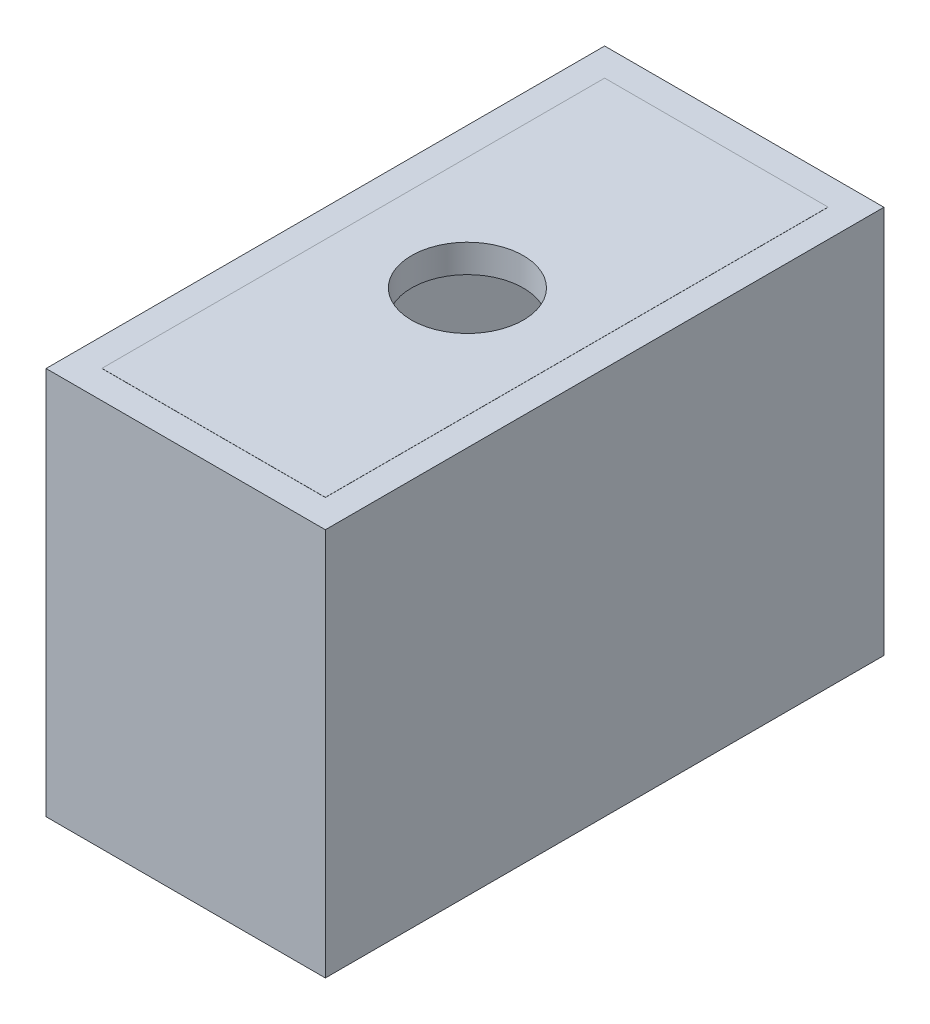
ISO-10303-21;
HEADER;
FILE_DESCRIPTION(('STEP AP214'),'2;1');
FILE_NAME('part.step','',(''),(''),'','','');
FILE_SCHEMA(('AUTOMOTIVE_DESIGN { 1 0 10303 214 1 1 1 1 }'));
ENDSEC;
DATA;
#1=APPLICATION_CONTEXT('core data for automotive mechanical design processes');
#2=APPLICATION_PROTOCOL_DEFINITION('international standard','automotive_design',2000,#1);
#3=PRODUCT_CONTEXT('',#1,'mechanical');
#4=PRODUCT('Part','Part','',(#3));
#5=PRODUCT_RELATED_PRODUCT_CATEGORY('part','',(#4));
#6=PRODUCT_DEFINITION_FORMATION('','',#4);
#7=PRODUCT_DEFINITION_CONTEXT('part definition',#1,'design');
#8=PRODUCT_DEFINITION('design','',#6,#7);
#9=PRODUCT_DEFINITION_SHAPE('','',#8);
#10=(LENGTH_UNIT() NAMED_UNIT(*) SI_UNIT(.MILLI.,.METRE.));
#11=(NAMED_UNIT(*) PLANE_ANGLE_UNIT() SI_UNIT($,.RADIAN.));
#12=(NAMED_UNIT(*) SI_UNIT($,.STERADIAN.) SOLID_ANGLE_UNIT());
#13=UNCERTAINTY_MEASURE_WITH_UNIT(LENGTH_MEASURE(1.E-05),#10,'distance_accuracy_value','');
#14=(GEOMETRIC_REPRESENTATION_CONTEXT(3) GLOBAL_UNCERTAINTY_ASSIGNED_CONTEXT((#13)) GLOBAL_UNIT_ASSIGNED_CONTEXT((#10,
#11,#12)) REPRESENTATION_CONTEXT('',''));
#15=CARTESIAN_POINT('',(0.,0.,0.));
#16=DIRECTION('',(0.,0.,1.));
#17=DIRECTION('',(1.,0.,0.));
#18=AXIS2_PLACEMENT_3D('',#15,#16,#17);
#19=CARTESIAN_POINT('',(-20.5611392405063,70.61,-22.9564556962026));
#20=DIRECTION('',(1.,0.,0.));
#21=DIRECTION('',(0.,0.,-1.));
#22=AXIS2_PLACEMENT_3D('',#19,#20,#21);
#23=PLANE('',#22);
#24=DIRECTION('',(0.,-1.,0.));
#25=VECTOR('',#24,1.);
#26=CARTESIAN_POINT('',(-20.5611392405063,70.61,-22.9564556962026));
#27=LINE('',#26,#25);
#28=CARTESIAN_POINT('',(-20.5611392405063,65.53,-22.9564556962026));
#29=VERTEX_POINT('',#28);
#30=CARTESIAN_POINT('',(-20.5611392405063,0.,-22.9564556962026));
#31=VERTEX_POINT('',#30);
#32=EDGE_CURVE('E202',#29,#31,#27,.T.);
#33=ORIENTED_EDGE('',*,*,#32,.F.);
#34=DIRECTION('',(0.,0.,1.));
#35=VECTOR('',#34,1.);
#36=CARTESIAN_POINT('',(-20.5611392405063,65.53,-22.9564556962026));
#37=LINE('',#36,#35);
#38=CARTESIAN_POINT('',(-20.5611392405063,65.53,68.4835443037974));
#39=VERTEX_POINT('',#38);
#40=EDGE_CURVE('E55',#29,#39,#37,.T.);
#41=ORIENTED_EDGE('',*,*,#40,.T.);
#42=DIRECTION('',(0.,-1.,0.));
#43=VECTOR('',#42,1.);
#44=CARTESIAN_POINT('',(-20.5611392405063,70.61,68.4835443037974));
#45=LINE('',#44,#43);
#46=CARTESIAN_POINT('',(-20.5611392405063,0.,68.4835443037974));
#47=VERTEX_POINT('',#46);
#48=EDGE_CURVE('E225',#39,#47,#45,.T.);
#49=ORIENTED_EDGE('',*,*,#48,.T.);
#50=DIRECTION('',(0.,0.,1.));
#51=VECTOR('',#50,1.);
#52=CARTESIAN_POINT('',(-20.5611392405063,0.,-22.9564556962026));
#53=LINE('',#52,#51);
#54=EDGE_CURVE('E185',#31,#47,#53,.T.);
#55=ORIENTED_EDGE('',*,*,#54,.F.);
#56=EDGE_LOOP('',(#33,#41,#49,#55));
#57=FACE_BOUND('',#56,.T.);
#58=ADVANCED_FACE('F39',(#57),#23,.T.);
#59=CARTESIAN_POINT('',(-20.5611392405063,70.61,68.4835443037974));
#60=DIRECTION('',(0.,0.,-1.));
#61=DIRECTION('',(-1.,0.,0.));
#62=AXIS2_PLACEMENT_3D('',#59,#60,#61);
#63=PLANE('',#62);
#64=ORIENTED_EDGE('',*,*,#48,.F.);
#65=DIRECTION('',(1.,0.,0.));
#66=VECTOR('',#65,1.);
#67=CARTESIAN_POINT('',(-20.5611392405063,65.53,68.4835443037974));
#68=LINE('',#67,#66);
#69=CARTESIAN_POINT('',(20.0788607594937,65.53,68.4835443037974));
#70=VERTEX_POINT('',#69);
#71=EDGE_CURVE('E172',#39,#70,#68,.T.);
#72=ORIENTED_EDGE('',*,*,#71,.T.);
#73=DIRECTION('',(0.,-1.,0.));
#74=VECTOR('',#73,1.);
#75=CARTESIAN_POINT('',(20.0788607594937,70.61,68.4835443037974));
#76=LINE('',#75,#74);
#77=CARTESIAN_POINT('',(20.0788607594937,0.,68.4835443037974));
#78=VERTEX_POINT('',#77);
#79=EDGE_CURVE('E222',#70,#78,#76,.T.);
#80=ORIENTED_EDGE('',*,*,#79,.T.);
#81=DIRECTION('',(1.,0.,0.));
#82=VECTOR('',#81,1.);
#83=CARTESIAN_POINT('',(-20.5611392405063,0.,68.4835443037974));
#84=LINE('',#83,#82);
#85=EDGE_CURVE('E206',#47,#78,#84,.T.);
#86=ORIENTED_EDGE('',*,*,#85,.F.);
#87=EDGE_LOOP('',(#64,#72,#80,#86));
#88=FACE_BOUND('',#87,.T.);
#89=ADVANCED_FACE('F292',(#88),#63,.T.);
#90=CARTESIAN_POINT('',(20.0788607594937,70.61,-22.9564556962026));
#91=DIRECTION('',(-1.,0.,0.));
#92=DIRECTION('',(0.,0.,1.));
#93=AXIS2_PLACEMENT_3D('',#90,#91,#92);
#94=PLANE('',#93);
#95=ORIENTED_EDGE('',*,*,#79,.F.);
#96=DIRECTION('',(0.,0.,-1.));
#97=VECTOR('',#96,1.);
#98=CARTESIAN_POINT('',(20.0788607594937,65.53,-22.9564556962026));
#99=LINE('',#98,#97);
#100=CARTESIAN_POINT('',(20.0788607594937,65.53,-22.9564556962026));
#101=VERTEX_POINT('',#100);
#102=EDGE_CURVE('E176',#70,#101,#99,.T.);
#103=ORIENTED_EDGE('',*,*,#102,.T.);
#104=DIRECTION('',(0.,-1.,0.));
#105=VECTOR('',#104,1.);
#106=CARTESIAN_POINT('',(20.0788607594937,70.61,-22.9564556962026));
#107=LINE('',#106,#105);
#108=CARTESIAN_POINT('',(20.0788607594937,0.,-22.9564556962026));
#109=VERTEX_POINT('',#108);
#110=EDGE_CURVE('E219',#101,#109,#107,.T.);
#111=ORIENTED_EDGE('',*,*,#110,.T.);
#112=DIRECTION('',(0.,0.,-1.));
#113=VECTOR('',#112,1.);
#114=CARTESIAN_POINT('',(20.0788607594937,0.,-22.9564556962026));
#115=LINE('',#114,#113);
#116=EDGE_CURVE('E210',#78,#109,#115,.T.);
#117=ORIENTED_EDGE('',*,*,#116,.F.);
#118=EDGE_LOOP('',(#95,#103,#111,#117));
#119=FACE_BOUND('',#118,.T.);
#120=ADVANCED_FACE('F298',(#119),#94,.T.);
#121=CARTESIAN_POINT('',(-20.5611392405063,70.61,-22.9564556962026));
#122=DIRECTION('',(0.,0.,1.));
#123=DIRECTION('',(1.,0.,0.));
#124=AXIS2_PLACEMENT_3D('',#121,#122,#123);
#125=PLANE('',#124);
#126=ORIENTED_EDGE('',*,*,#110,.F.);
#127=DIRECTION('',(-1.,0.,0.));
#128=VECTOR('',#127,1.);
#129=CARTESIAN_POINT('',(-20.5611392405063,65.53,-22.9564556962026));
#130=LINE('',#129,#128);
#131=EDGE_CURVE('E141',#101,#29,#130,.T.);
#132=ORIENTED_EDGE('',*,*,#131,.T.);
#133=ORIENTED_EDGE('',*,*,#32,.T.);
#134=DIRECTION('',(-1.,0.,0.));
#135=VECTOR('',#134,1.);
#136=CARTESIAN_POINT('',(-20.5611392405063,0.,-22.9564556962026));
#137=LINE('',#136,#135);
#138=EDGE_CURVE('E194',#109,#31,#137,.T.);
#139=ORIENTED_EDGE('',*,*,#138,.F.);
#140=EDGE_LOOP('',(#126,#132,#133,#139));
#141=FACE_BOUND('',#140,.T.);
#142=ADVANCED_FACE('F306',(#141),#125,.T.);
#143=CARTESIAN_POINT('',(0.,70.61,0.));
#144=DIRECTION('',(0.,1.,0.));
#145=DIRECTION('',(0.,0.,1.));
#146=AXIS2_PLACEMENT_3D('',#143,#144,#145);
#147=PLANE('',#146);
#148=DIRECTION('',(0.,0.,1.));
#149=VECTOR('',#148,1.);
#150=CARTESIAN_POINT('',(-25.6411392405063,70.61,-28.0364556962026));
#151=LINE('',#150,#149);
#152=CARTESIAN_POINT('',(-25.6411392405063,70.61,-28.0364556962026));
#153=VERTEX_POINT('',#152);
#154=CARTESIAN_POINT('',(-25.6411392405063,70.61,73.5635443037974));
#155=VERTEX_POINT('',#154);
#156=EDGE_CURVE('E229',#153,#155,#151,.T.);
#157=ORIENTED_EDGE('',*,*,#156,.T.);
#158=DIRECTION('',(1.,0.,0.));
#159=VECTOR('',#158,1.);
#160=CARTESIAN_POINT('',(-25.6411392405063,70.61,73.5635443037974));
#161=LINE('',#160,#159);
#162=CARTESIAN_POINT('',(25.1588607594937,70.61,73.5635443037974));
#163=VERTEX_POINT('',#162);
#164=EDGE_CURVE('E233',#155,#163,#161,.T.);
#165=ORIENTED_EDGE('',*,*,#164,.T.);
#166=DIRECTION('',(0.,0.,-1.));
#167=VECTOR('',#166,1.);
#168=CARTESIAN_POINT('',(25.1588607594937,70.61,-28.0364556962026));
#169=LINE('',#168,#167);
#170=CARTESIAN_POINT('',(25.1588607594937,70.61,-28.0364556962026));
#171=VERTEX_POINT('',#170);
#172=EDGE_CURVE('E237',#163,#171,#169,.T.);
#173=ORIENTED_EDGE('',*,*,#172,.T.);
#174=DIRECTION('',(-1.,0.,0.));
#175=VECTOR('',#174,1.);
#176=CARTESIAN_POINT('',(-25.6411392405063,70.61,-28.0364556962026));
#177=LINE('',#176,#175);
#178=EDGE_CURVE('E240',#171,#153,#177,.T.);
#179=ORIENTED_EDGE('',*,*,#178,.T.);
#180=EDGE_LOOP('',(#157,#165,#173,#179));
#181=FACE_BOUND('',#180,.T.);
#182=DIRECTION('',(1.,0.,0.));
#183=VECTOR('',#182,1.);
#184=CARTESIAN_POINT('',(-20.5611392405063,70.61,68.4835443037974));
#185=LINE('',#184,#183);
#186=CARTESIAN_POINT('',(-20.5611392405063,70.61,68.4835443037974));
#187=VERTEX_POINT('',#186);
#188=CARTESIAN_POINT('',(20.0788607594937,70.61,68.4835443037974));
#189=VERTEX_POINT('',#188);
#190=EDGE_CURVE('E193',#187,#189,#185,.T.);
#191=ORIENTED_EDGE('',*,*,#190,.F.);
#192=DIRECTION('',(0.,0.,1.));
#193=VECTOR('',#192,1.);
#194=CARTESIAN_POINT('',(-20.5611392405063,70.61,-22.9564556962026));
#195=LINE('',#194,#193);
#196=CARTESIAN_POINT('',(-20.5611392405063,70.61,-22.9564556962026));
#197=VERTEX_POINT('',#196);
#198=EDGE_CURVE('E136',#197,#187,#195,.T.);
#199=ORIENTED_EDGE('',*,*,#198,.F.);
#200=DIRECTION('',(-1.,0.,0.));
#201=VECTOR('',#200,1.);
#202=CARTESIAN_POINT('',(-20.5611392405063,70.61,-22.9564556962026));
#203=LINE('',#202,#201);
#204=CARTESIAN_POINT('',(20.0788607594937,70.61,-22.9564556962026));
#205=VERTEX_POINT('',#204);
#206=EDGE_CURVE('E63',#205,#197,#203,.T.);
#207=ORIENTED_EDGE('',*,*,#206,.F.);
#208=DIRECTION('',(0.,0.,-1.));
#209=VECTOR('',#208,1.);
#210=CARTESIAN_POINT('',(20.0788607594937,70.61,-22.9564556962026));
#211=LINE('',#210,#209);
#212=EDGE_CURVE('E197',#189,#205,#211,.T.);
#213=ORIENTED_EDGE('',*,*,#212,.F.);
#214=EDGE_LOOP('',(#191,#199,#207,#213));
#215=FACE_BOUND('',#214,.T.);
#216=ADVANCED_FACE('F283',(#181,#215),#147,.T.);
#217=CARTESIAN_POINT('',(0.,0.,0.));
#218=DIRECTION('',(0.,1.,0.));
#219=DIRECTION('',(0.,0.,1.));
#220=AXIS2_PLACEMENT_3D('',#217,#218,#219);
#221=PLANE('',#220);
#222=DIRECTION('',(0.,0.,1.));
#223=VECTOR('',#222,1.);
#224=CARTESIAN_POINT('',(-25.6411392405063,0.,-28.0364556962026));
#225=LINE('',#224,#223);
#226=CARTESIAN_POINT('',(-25.6411392405063,0.,-28.0364556962026));
#227=VERTEX_POINT('',#226);
#228=CARTESIAN_POINT('',(-25.6411392405063,0.,73.5635443037974));
#229=VERTEX_POINT('',#228);
#230=EDGE_CURVE('E228',#227,#229,#225,.T.);
#231=ORIENTED_EDGE('',*,*,#230,.F.);
#232=DIRECTION('',(-1.,0.,0.));
#233=VECTOR('',#232,1.);
#234=CARTESIAN_POINT('',(-25.6411392405063,0.,-28.0364556962026));
#235=LINE('',#234,#233);
#236=CARTESIAN_POINT('',(25.1588607594937,0.,-28.0364556962026));
#237=VERTEX_POINT('',#236);
#238=EDGE_CURVE('E234',#237,#227,#235,.T.);
#239=ORIENTED_EDGE('',*,*,#238,.F.);
#240=DIRECTION('',(0.,0.,-1.));
#241=VECTOR('',#240,1.);
#242=CARTESIAN_POINT('',(25.1588607594937,0.,-28.0364556962026));
#243=LINE('',#242,#241);
#244=CARTESIAN_POINT('',(25.1588607594937,0.,73.5635443037974));
#245=VERTEX_POINT('',#244);
#246=EDGE_CURVE('E250',#245,#237,#243,.T.);
#247=ORIENTED_EDGE('',*,*,#246,.F.);
#248=DIRECTION('',(1.,0.,0.));
#249=VECTOR('',#248,1.);
#250=CARTESIAN_POINT('',(-25.6411392405063,0.,73.5635443037974));
#251=LINE('',#250,#249);
#252=EDGE_CURVE('E247',#229,#245,#251,.T.);
#253=ORIENTED_EDGE('',*,*,#252,.F.);
#254=EDGE_LOOP('',(#231,#239,#247,#253));
#255=FACE_BOUND('',#254,.T.);
#256=ORIENTED_EDGE('',*,*,#54,.T.);
#257=ORIENTED_EDGE('',*,*,#85,.T.);
#258=ORIENTED_EDGE('',*,*,#116,.T.);
#259=ORIENTED_EDGE('',*,*,#138,.T.);
#260=EDGE_LOOP('',(#256,#257,#258,#259));
#261=FACE_BOUND('',#260,.T.);
#262=ADVANCED_FACE('F273',(#255,#261),#221,.F.);
#263=CARTESIAN_POINT('',(-25.6411392405063,70.61,-28.0364556962026));
#264=DIRECTION('',(1.,0.,0.));
#265=DIRECTION('',(0.,0.,-1.));
#266=AXIS2_PLACEMENT_3D('',#263,#264,#265);
#267=PLANE('',#266);
#268=ORIENTED_EDGE('',*,*,#230,.T.);
#269=DIRECTION('',(0.,-1.,0.));
#270=VECTOR('',#269,1.);
#271=CARTESIAN_POINT('',(-25.6411392405063,70.61,73.5635443037974));
#272=LINE('',#271,#270);
#273=EDGE_CURVE('E11',#155,#229,#272,.T.);
#274=ORIENTED_EDGE('',*,*,#273,.F.);
#275=ORIENTED_EDGE('',*,*,#156,.F.);
#276=DIRECTION('',(0.,-1.,0.));
#277=VECTOR('',#276,1.);
#278=CARTESIAN_POINT('',(-25.6411392405063,70.61,-28.0364556962026));
#279=LINE('',#278,#277);
#280=EDGE_CURVE('E243',#153,#227,#279,.T.);
#281=ORIENTED_EDGE('',*,*,#280,.T.);
#282=EDGE_LOOP('',(#268,#274,#275,#281));
#283=FACE_BOUND('',#282,.T.);
#284=ADVANCED_FACE('F41',(#283),#267,.F.);
#285=CARTESIAN_POINT('',(-25.6411392405063,70.61,73.5635443037974));
#286=DIRECTION('',(0.,0.,-1.));
#287=DIRECTION('',(-1.,0.,0.));
#288=AXIS2_PLACEMENT_3D('',#285,#286,#287);
#289=PLANE('',#288);
#290=ORIENTED_EDGE('',*,*,#252,.T.);
#291=DIRECTION('',(0.,-1.,0.));
#292=VECTOR('',#291,1.);
#293=CARTESIAN_POINT('',(25.1588607594937,70.61,73.5635443037974));
#294=LINE('',#293,#292);
#295=EDGE_CURVE('E48',#163,#245,#294,.T.);
#296=ORIENTED_EDGE('',*,*,#295,.F.);
#297=ORIENTED_EDGE('',*,*,#164,.F.);
#298=ORIENTED_EDGE('',*,*,#273,.T.);
#299=EDGE_LOOP('',(#290,#296,#297,#298));
#300=FACE_BOUND('',#299,.T.);
#301=ADVANCED_FACE('F284',(#300),#289,.F.);
#302=CARTESIAN_POINT('',(25.1588607594937,70.61,-28.0364556962026));
#303=DIRECTION('',(-1.,0.,0.));
#304=DIRECTION('',(0.,0.,1.));
#305=AXIS2_PLACEMENT_3D('',#302,#303,#304);
#306=PLANE('',#305);
#307=ORIENTED_EDGE('',*,*,#246,.T.);
#308=DIRECTION('',(0.,-1.,0.));
#309=VECTOR('',#308,1.);
#310=CARTESIAN_POINT('',(25.1588607594937,70.61,-28.0364556962026));
#311=LINE('',#310,#309);
#312=EDGE_CURVE('E258',#171,#237,#311,.T.);
#313=ORIENTED_EDGE('',*,*,#312,.F.);
#314=ORIENTED_EDGE('',*,*,#172,.F.);
#315=ORIENTED_EDGE('',*,*,#295,.T.);
#316=EDGE_LOOP('',(#307,#313,#314,#315));
#317=FACE_BOUND('',#316,.T.);
#318=ADVANCED_FACE('F267',(#317),#306,.F.);
#319=CARTESIAN_POINT('',(-25.6411392405063,70.61,-28.0364556962026));
#320=DIRECTION('',(0.,0.,1.));
#321=DIRECTION('',(1.,0.,0.));
#322=AXIS2_PLACEMENT_3D('',#319,#320,#321);
#323=PLANE('',#322);
#324=ORIENTED_EDGE('',*,*,#238,.T.);
#325=ORIENTED_EDGE('',*,*,#280,.F.);
#326=ORIENTED_EDGE('',*,*,#178,.F.);
#327=ORIENTED_EDGE('',*,*,#312,.T.);
#328=EDGE_LOOP('',(#324,#325,#326,#327));
#329=FACE_BOUND('',#328,.T.);
#330=ADVANCED_FACE('F277',(#329),#323,.F.);
#331=CARTESIAN_POINT('',(0.,65.53,0.));
#332=DIRECTION('',(0.,1.,0.));
#333=DIRECTION('',(0.,0.,1.));
#334=AXIS2_PLACEMENT_3D('',#331,#332,#333);
#335=PLANE('',#334);
#336=CARTESIAN_POINT('',(0.,65.53,22.5656166060903));
#337=DIRECTION('',(0.,1.,0.));
#338=DIRECTION('',(0.,0.,1.));
#339=AXIS2_PLACEMENT_3D('',#336,#337,#338);
#340=CIRCLE('',#339,10.1717099712481);
#341=CARTESIAN_POINT('',(0.,65.53,32.7373265773385));
#342=VERTEX_POINT('',#341);
#343=EDGE_CURVE('E158',#342,#342,#340,.T.);
#344=ORIENTED_EDGE('',*,*,#343,.T.);
#345=EDGE_LOOP('',(#344));
#346=FACE_BOUND('',#345,.T.);
#347=ORIENTED_EDGE('',*,*,#40,.F.);
#348=ORIENTED_EDGE('',*,*,#131,.F.);
#349=ORIENTED_EDGE('',*,*,#102,.F.);
#350=ORIENTED_EDGE('',*,*,#71,.F.);
#351=EDGE_LOOP('',(#347,#348,#349,#350));
#352=FACE_BOUND('',#351,.T.);
#353=ADVANCED_FACE('F310',(#346,#352),#335,.F.);
#354=CARTESIAN_POINT('',(-20.5611392405063,65.53,-22.9564556962026));
#355=DIRECTION('',(-1.,0.,0.));
#356=DIRECTION('',(0.,0.,1.));
#357=AXIS2_PLACEMENT_3D('',#354,#355,#356);
#358=PLANE('',#357);
#359=DIRECTION('',(0.,1.,0.));
#360=VECTOR('',#359,1.);
#361=CARTESIAN_POINT('',(-20.5611392405063,65.53,-22.9564556962026));
#362=LINE('',#361,#360);
#363=CARTESIAN_POINT('',(-20.5611392405063,70.6354,-22.9564556962026));
#364=VERTEX_POINT('',#363);
#365=EDGE_CURVE('E182',#197,#364,#362,.T.);
#366=ORIENTED_EDGE('',*,*,#365,.F.);
#367=ORIENTED_EDGE('',*,*,#198,.T.);
#368=DIRECTION('',(0.,1.,0.));
#369=VECTOR('',#368,1.);
#370=CARTESIAN_POINT('',(-20.5611392405063,65.53,68.4835443037974));
#371=LINE('',#370,#369);
#372=CARTESIAN_POINT('',(-20.5611392405063,70.6354,68.4835443037974));
#373=VERTEX_POINT('',#372);
#374=EDGE_CURVE('E130',#187,#373,#371,.T.);
#375=ORIENTED_EDGE('',*,*,#374,.T.);
#376=DIRECTION('',(0.,0.,1.));
#377=VECTOR('',#376,1.);
#378=CARTESIAN_POINT('',(-20.5611392405063,70.6354,-22.9564556962026));
#379=LINE('',#378,#377);
#380=EDGE_CURVE('E135',#364,#373,#379,.T.);
#381=ORIENTED_EDGE('',*,*,#380,.F.);
#382=EDGE_LOOP('',(#366,#367,#375,#381));
#383=FACE_BOUND('',#382,.T.);
#384=ADVANCED_FACE('F133',(#383),#358,.T.);
#385=CARTESIAN_POINT('',(-20.5611392405063,65.53,-22.9564556962026));
#386=DIRECTION('',(0.,0.,-1.));
#387=DIRECTION('',(-1.,0.,0.));
#388=AXIS2_PLACEMENT_3D('',#385,#386,#387);
#389=PLANE('',#388);
#390=DIRECTION('',(0.,1.,0.));
#391=VECTOR('',#390,1.);
#392=CARTESIAN_POINT('',(20.0788607594937,65.53,-22.9564556962026));
#393=LINE('',#392,#391);
#394=CARTESIAN_POINT('',(20.0788607594937,70.6354,-22.9564556962026));
#395=VERTEX_POINT('',#394);
#396=EDGE_CURVE('E186',#205,#395,#393,.T.);
#397=ORIENTED_EDGE('',*,*,#396,.F.);
#398=ORIENTED_EDGE('',*,*,#206,.T.);
#399=ORIENTED_EDGE('',*,*,#365,.T.);
#400=DIRECTION('',(-1.,0.,0.));
#401=VECTOR('',#400,1.);
#402=CARTESIAN_POINT('',(-20.5611392405063,70.6354,-22.9564556962026));
#403=LINE('',#402,#401);
#404=EDGE_CURVE('E156',#395,#364,#403,.T.);
#405=ORIENTED_EDGE('',*,*,#404,.F.);
#406=EDGE_LOOP('',(#397,#398,#399,#405));
#407=FACE_BOUND('',#406,.T.);
#408=ADVANCED_FACE('F319',(#407),#389,.T.);
#409=CARTESIAN_POINT('',(20.0788607594937,65.53,-22.9564556962026));
#410=DIRECTION('',(1.,0.,0.));
#411=DIRECTION('',(0.,0.,-1.));
#412=AXIS2_PLACEMENT_3D('',#409,#410,#411);
#413=PLANE('',#412);
#414=DIRECTION('',(0.,1.,0.));
#415=VECTOR('',#414,1.);
#416=CARTESIAN_POINT('',(20.0788607594937,65.53,68.4835443037974));
#417=LINE('',#416,#415);
#418=CARTESIAN_POINT('',(20.0788607594937,70.6354,68.4835443037974));
#419=VERTEX_POINT('',#418);
#420=EDGE_CURVE('E140',#189,#419,#417,.T.);
#421=ORIENTED_EDGE('',*,*,#420,.F.);
#422=ORIENTED_EDGE('',*,*,#212,.T.);
#423=ORIENTED_EDGE('',*,*,#396,.T.);
#424=DIRECTION('',(0.,0.,-1.));
#425=VECTOR('',#424,1.);
#426=CARTESIAN_POINT('',(20.0788607594937,70.6354,-22.9564556962026));
#427=LINE('',#426,#425);
#428=EDGE_CURVE('E151',#419,#395,#427,.T.);
#429=ORIENTED_EDGE('',*,*,#428,.F.);
#430=EDGE_LOOP('',(#421,#422,#423,#429));
#431=FACE_BOUND('',#430,.T.);
#432=ADVANCED_FACE('F326',(#431),#413,.T.);
#433=CARTESIAN_POINT('',(-20.5611392405063,65.53,68.4835443037974));
#434=DIRECTION('',(0.,0.,1.));
#435=DIRECTION('',(1.,0.,0.));
#436=AXIS2_PLACEMENT_3D('',#433,#434,#435);
#437=PLANE('',#436);
#438=ORIENTED_EDGE('',*,*,#374,.F.);
#439=ORIENTED_EDGE('',*,*,#190,.T.);
#440=ORIENTED_EDGE('',*,*,#420,.T.);
#441=DIRECTION('',(1.,0.,0.));
#442=VECTOR('',#441,1.);
#443=CARTESIAN_POINT('',(-20.5611392405063,70.6354,68.4835443037974));
#444=LINE('',#443,#442);
#445=EDGE_CURVE('E144',#373,#419,#444,.T.);
#446=ORIENTED_EDGE('',*,*,#445,.F.);
#447=EDGE_LOOP('',(#438,#439,#440,#446));
#448=FACE_BOUND('',#447,.T.);
#449=ADVANCED_FACE('F145',(#448),#437,.T.);
#450=CARTESIAN_POINT('',(0.,70.6354,0.));
#451=DIRECTION('',(0.,1.,0.));
#452=DIRECTION('',(0.,0.,1.));
#453=AXIS2_PLACEMENT_3D('',#450,#451,#452);
#454=PLANE('',#453);
#455=CARTESIAN_POINT('',(0.,70.6354,22.5656166060903));
#456=DIRECTION('',(0.,1.,0.));
#457=DIRECTION('',(0.,0.,1.));
#458=AXIS2_PLACEMENT_3D('',#455,#456,#457);
#459=CIRCLE('',#458,10.1717099712481);
#460=CARTESIAN_POINT('',(0.,70.6354,32.7373265773385));
#461=VERTEX_POINT('',#460);
#462=EDGE_CURVE('E162',#461,#461,#459,.T.);
#463=ORIENTED_EDGE('',*,*,#462,.F.);
#464=EDGE_LOOP('',(#463));
#465=FACE_BOUND('',#464,.T.);
#466=ORIENTED_EDGE('',*,*,#380,.T.);
#467=ORIENTED_EDGE('',*,*,#445,.T.);
#468=ORIENTED_EDGE('',*,*,#428,.T.);
#469=ORIENTED_EDGE('',*,*,#404,.T.);
#470=EDGE_LOOP('',(#466,#467,#468,#469));
#471=FACE_BOUND('',#470,.T.);
#472=ADVANCED_FACE('F154',(#465,#471),#454,.T.);
#473=CARTESIAN_POINT('',(0.,0.,22.5656166060903));
#474=DIRECTION('',(0.,1.,0.));
#475=DIRECTION('',(0.,0.,1.));
#476=AXIS2_PLACEMENT_3D('',#473,#474,#475);
#477=CYLINDRICAL_SURFACE('',#476,10.1717099712481);
#478=ORIENTED_EDGE('',*,*,#462,.T.);
#479=EDGE_LOOP('',(#478));
#480=FACE_BOUND('',#479,.T.);
#481=ORIENTED_EDGE('',*,*,#343,.F.);
#482=EDGE_LOOP('',(#481));
#483=FACE_BOUND('',#482,.T.);
#484=ADVANCED_FACE('F424',(#480,#483),#477,.F.);
#485=CLOSED_SHELL('',(#58,#89,#120,#142,#216,#262,#284,#301,#318,#330,#353,#384,#408,#432,#449,
#472,#484));
#486=MANIFOLD_SOLID_BREP('B2',#485);
#487=ADVANCED_BREP_SHAPE_REPRESENTATION('',(#18,#486),#14);
#488=SHAPE_DEFINITION_REPRESENTATION(#9,#487);
ENDSEC;
END-ISO-10303-21;
